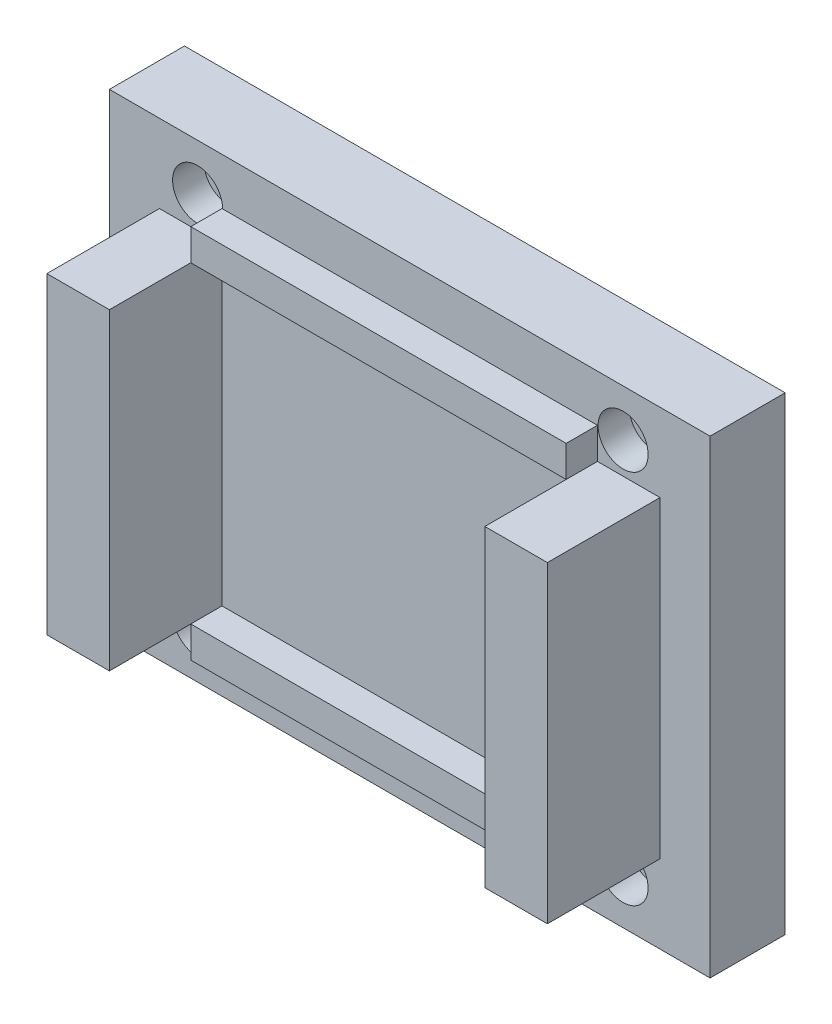
ISO-10303-21;
HEADER;
FILE_DESCRIPTION(('STEP AP214'),'2;1');
FILE_NAME('part.step','',(''),(''),'','','');
FILE_SCHEMA(('AUTOMOTIVE_DESIGN { 1 0 10303 214 1 1 1 1 }'));
ENDSEC;
DATA;
#1=APPLICATION_CONTEXT('core data for automotive mechanical design processes');
#2=APPLICATION_PROTOCOL_DEFINITION('international standard','automotive_design',2000,#1);
#3=PRODUCT_CONTEXT('',#1,'mechanical');
#4=PRODUCT('Part','Part','',(#3));
#5=PRODUCT_RELATED_PRODUCT_CATEGORY('part','',(#4));
#6=PRODUCT_DEFINITION_FORMATION('','',#4);
#7=PRODUCT_DEFINITION_CONTEXT('part definition',#1,'design');
#8=PRODUCT_DEFINITION('design','',#6,#7);
#9=PRODUCT_DEFINITION_SHAPE('','',#8);
#10=(LENGTH_UNIT() NAMED_UNIT(*) SI_UNIT(.MILLI.,.METRE.));
#11=(NAMED_UNIT(*) PLANE_ANGLE_UNIT() SI_UNIT($,.RADIAN.));
#12=(NAMED_UNIT(*) SI_UNIT($,.STERADIAN.) SOLID_ANGLE_UNIT());
#13=UNCERTAINTY_MEASURE_WITH_UNIT(LENGTH_MEASURE(1.E-05),#10,'distance_accuracy_value','');
#14=(GEOMETRIC_REPRESENTATION_CONTEXT(3) GLOBAL_UNCERTAINTY_ASSIGNED_CONTEXT((#13)) GLOBAL_UNIT_ASSIGNED_CONTEXT((#10,
#11,#12)) REPRESENTATION_CONTEXT('',''));
#15=CARTESIAN_POINT('',(0.,0.,0.));
#16=DIRECTION('',(0.,0.,1.));
#17=DIRECTION('',(1.,0.,0.));
#18=AXIS2_PLACEMENT_3D('',#15,#16,#17);
#19=CARTESIAN_POINT('',(18.,12.5,17.));
#20=DIRECTION('',(1.,0.,0.));
#21=DIRECTION('',(0.,0.,-1.));
#22=AXIS2_PLACEMENT_3D('',#19,#20,#21);
#23=PLANE('',#22);
#24=DIRECTION('',(0.,-1.,0.));
#25=VECTOR('',#24,1.);
#26=CARTESIAN_POINT('',(18.,12.5,12.));
#27=LINE('',#26,#25);
#28=CARTESIAN_POINT('',(18.,12.5,12.));
#29=VERTEX_POINT('',#28);
#30=CARTESIAN_POINT('',(18.,7.5,12.));
#31=VERTEX_POINT('',#30);
#32=EDGE_CURVE('E113',#29,#31,#27,.T.);
#33=ORIENTED_EDGE('',*,*,#32,.T.);
#34=DIRECTION('',(0.,0.,-1.));
#35=VECTOR('',#34,1.);
#36=CARTESIAN_POINT('',(18.,7.5,17.));
#37=LINE('',#36,#35);
#38=CARTESIAN_POINT('',(18.,7.5,17.));
#39=VERTEX_POINT('',#38);
#40=EDGE_CURVE('E12',#39,#31,#37,.T.);
#41=ORIENTED_EDGE('',*,*,#40,.F.);
#42=DIRECTION('',(0.,-1.,0.));
#43=VECTOR('',#42,1.);
#44=CARTESIAN_POINT('',(18.,12.5,17.));
#45=LINE('',#44,#43);
#46=CARTESIAN_POINT('',(18.,12.5,17.));
#47=VERTEX_POINT('',#46);
#48=EDGE_CURVE('E101',#47,#39,#45,.T.);
#49=ORIENTED_EDGE('',*,*,#48,.F.);
#50=DIRECTION('',(0.,0.,-1.));
#51=VECTOR('',#50,1.);
#52=CARTESIAN_POINT('',(18.,12.5,17.));
#53=LINE('',#52,#51);
#54=EDGE_CURVE('E109',#47,#29,#53,.T.);
#55=ORIENTED_EDGE('',*,*,#54,.T.);
#56=EDGE_LOOP('',(#33,#41,#49,#55));
#57=FACE_BOUND('',#56,.T.);
#58=ADVANCED_FACE('F50',(#57),#23,.F.);
#59=CARTESIAN_POINT('',(18.,7.5,17.));
#60=DIRECTION('',(0.,1.,0.));
#61=DIRECTION('',(0.,0.,1.));
#62=AXIS2_PLACEMENT_3D('',#59,#60,#61);
#63=PLANE('',#62);
#64=DIRECTION('',(1.,0.,0.));
#65=VECTOR('',#64,1.);
#66=CARTESIAN_POINT('',(18.,7.5,12.));
#67=LINE('',#66,#65);
#68=CARTESIAN_POINT('',(78.,7.5,12.));
#69=VERTEX_POINT('',#68);
#70=EDGE_CURVE('E105',#31,#69,#67,.T.);
#71=ORIENTED_EDGE('',*,*,#70,.T.);
#72=DIRECTION('',(0.,0.,-1.));
#73=VECTOR('',#72,1.);
#74=CARTESIAN_POINT('',(78.,7.5,17.));
#75=LINE('',#74,#73);
#76=CARTESIAN_POINT('',(78.,7.5,17.));
#77=VERTEX_POINT('',#76);
#78=EDGE_CURVE('E58',#77,#69,#75,.T.);
#79=ORIENTED_EDGE('',*,*,#78,.F.);
#80=DIRECTION('',(1.,0.,0.));
#81=VECTOR('',#80,1.);
#82=CARTESIAN_POINT('',(18.,7.5,17.));
#83=LINE('',#82,#81);
#84=EDGE_CURVE('E96',#39,#77,#83,.T.);
#85=ORIENTED_EDGE('',*,*,#84,.F.);
#86=ORIENTED_EDGE('',*,*,#40,.T.);
#87=EDGE_LOOP('',(#71,#79,#85,#86));
#88=FACE_BOUND('',#87,.T.);
#89=ADVANCED_FACE('F104',(#88),#63,.F.);
#90=CARTESIAN_POINT('',(78.,12.5,17.));
#91=DIRECTION('',(-1.,0.,0.));
#92=DIRECTION('',(0.,0.,1.));
#93=AXIS2_PLACEMENT_3D('',#90,#91,#92);
#94=PLANE('',#93);
#95=DIRECTION('',(0.,1.,0.));
#96=VECTOR('',#95,1.);
#97=CARTESIAN_POINT('',(78.,12.5,12.));
#98=LINE('',#97,#96);
#99=CARTESIAN_POINT('',(78.,12.5,12.));
#100=VERTEX_POINT('',#99);
#101=EDGE_CURVE('E83',#69,#100,#98,.T.);
#102=ORIENTED_EDGE('',*,*,#101,.T.);
#103=DIRECTION('',(0.,0.,-1.));
#104=VECTOR('',#103,1.);
#105=CARTESIAN_POINT('',(78.,12.5,17.));
#106=LINE('',#105,#104);
#107=CARTESIAN_POINT('',(78.,12.5,17.));
#108=VERTEX_POINT('',#107);
#109=EDGE_CURVE('E106',#108,#100,#106,.T.);
#110=ORIENTED_EDGE('',*,*,#109,.F.);
#111=DIRECTION('',(0.,1.,0.));
#112=VECTOR('',#111,1.);
#113=CARTESIAN_POINT('',(78.,12.5,17.));
#114=LINE('',#113,#112);
#115=EDGE_CURVE('E99',#77,#108,#114,.T.);
#116=ORIENTED_EDGE('',*,*,#115,.F.);
#117=ORIENTED_EDGE('',*,*,#78,.T.);
#118=EDGE_LOOP('',(#102,#110,#116,#117));
#119=FACE_BOUND('',#118,.T.);
#120=ADVANCED_FACE('F107',(#119),#94,.F.);
#121=CARTESIAN_POINT('',(18.,12.5,17.));
#122=DIRECTION('',(0.,-1.,0.));
#123=DIRECTION('',(1.,0.,0.));
#124=AXIS2_PLACEMENT_3D('',#121,#122,#123);
#125=PLANE('',#124);
#126=DIRECTION('',(-1.,0.,0.));
#127=VECTOR('',#126,1.);
#128=CARTESIAN_POINT('',(18.,12.5,12.));
#129=LINE('',#128,#127);
#130=EDGE_CURVE('E89',#100,#29,#129,.T.);
#131=ORIENTED_EDGE('',*,*,#130,.T.);
#132=ORIENTED_EDGE('',*,*,#54,.F.);
#133=DIRECTION('',(-1.,0.,0.));
#134=VECTOR('',#133,1.);
#135=CARTESIAN_POINT('',(18.,12.5,17.));
#136=LINE('',#135,#134);
#137=EDGE_CURVE('E66',#108,#47,#136,.T.);
#138=ORIENTED_EDGE('',*,*,#137,.F.);
#139=ORIENTED_EDGE('',*,*,#109,.T.);
#140=EDGE_LOOP('',(#131,#132,#138,#139));
#141=FACE_BOUND('',#140,.T.);
#142=ADVANCED_FACE('F120',(#141),#125,.F.);
#143=CARTESIAN_POINT('',(0.,0.,17.));
#144=DIRECTION('',(0.,0.,1.));
#145=DIRECTION('',(1.,0.,0.));
#146=AXIS2_PLACEMENT_3D('',#143,#144,#145);
#147=PLANE('',#146);
#148=ORIENTED_EDGE('',*,*,#48,.T.);
#149=ORIENTED_EDGE('',*,*,#84,.T.);
#150=ORIENTED_EDGE('',*,*,#115,.T.);
#151=ORIENTED_EDGE('',*,*,#137,.T.);
#152=EDGE_LOOP('',(#148,#149,#150,#151));
#153=FACE_BOUND('',#152,.T.);
#154=ADVANCED_FACE('F97',(#153),#147,.T.);
#155=CARTESIAN_POINT('',(0.,0.,12.));
#156=DIRECTION('',(0.,0.,1.));
#157=DIRECTION('',(1.,0.,0.));
#158=AXIS2_PLACEMENT_3D('',#155,#156,#157);
#159=PLANE('',#158);
#160=ORIENTED_EDGE('',*,*,#32,.F.);
#161=ORIENTED_EDGE('',*,*,#130,.F.);
#162=ORIENTED_EDGE('',*,*,#101,.F.);
#163=ORIENTED_EDGE('',*,*,#70,.F.);
#164=EDGE_LOOP('',(#160,#161,#162,#163));
#165=FACE_BOUND('',#164,.T.);
#166=ADVANCED_FACE('F123',(#165),#159,.F.);
#167=CLOSED_SHELL('',(#58,#89,#120,#142,#154,#166));
#168=MANIFOLD_SOLID_BREP('B2',#167);
#169=CARTESIAN_POINT('',(78.,62.5,17.));
#170=DIRECTION('',(-1.,0.,0.));
#171=DIRECTION('',(0.,0.,1.));
#172=AXIS2_PLACEMENT_3D('',#169,#170,#171);
#173=PLANE('',#172);
#174=DIRECTION('',(0.,1.,0.));
#175=VECTOR('',#174,1.);
#176=CARTESIAN_POINT('',(78.,62.5,12.));
#177=LINE('',#176,#175);
#178=CARTESIAN_POINT('',(78.,62.5,12.));
#179=VERTEX_POINT('',#178);
#180=CARTESIAN_POINT('',(78.,67.5,12.));
#181=VERTEX_POINT('',#180);
#182=EDGE_CURVE('E245',#179,#181,#177,.T.);
#183=ORIENTED_EDGE('',*,*,#182,.T.);
#184=DIRECTION('',(0.,0.,-1.));
#185=VECTOR('',#184,1.);
#186=CARTESIAN_POINT('',(78.,67.5,17.));
#187=LINE('',#186,#185);
#188=CARTESIAN_POINT('',(78.,67.5,17.));
#189=VERTEX_POINT('',#188);
#190=EDGE_CURVE('E48',#189,#181,#187,.T.);
#191=ORIENTED_EDGE('',*,*,#190,.F.);
#192=DIRECTION('',(0.,1.,0.));
#193=VECTOR('',#192,1.);
#194=CARTESIAN_POINT('',(78.,62.5,17.));
#195=LINE('',#194,#193);
#196=CARTESIAN_POINT('',(78.,62.5,17.));
#197=VERTEX_POINT('',#196);
#198=EDGE_CURVE('E222',#197,#189,#195,.T.);
#199=ORIENTED_EDGE('',*,*,#198,.F.);
#200=DIRECTION('',(0.,0.,-1.));
#201=VECTOR('',#200,1.);
#202=CARTESIAN_POINT('',(78.,62.5,17.));
#203=LINE('',#202,#201);
#204=EDGE_CURVE('E241',#197,#179,#203,.T.);
#205=ORIENTED_EDGE('',*,*,#204,.T.);
#206=EDGE_LOOP('',(#183,#191,#199,#205));
#207=FACE_BOUND('',#206,.T.);
#208=ADVANCED_FACE('F183',(#207),#173,.F.);
#209=CARTESIAN_POINT('',(18.,67.5,17.));
#210=DIRECTION('',(0.,1.,0.));
#211=DIRECTION('',(0.,0.,1.));
#212=AXIS2_PLACEMENT_3D('',#209,#210,#211);
#213=PLANE('',#212);
#214=DIRECTION('',(1.,0.,0.));
#215=VECTOR('',#214,1.);
#216=CARTESIAN_POINT('',(18.,67.5,12.));
#217=LINE('',#216,#215);
#218=CARTESIAN_POINT('',(18.,67.5,12.));
#219=VERTEX_POINT('',#218);
#220=EDGE_CURVE('E231',#219,#181,#217,.T.);
#221=ORIENTED_EDGE('',*,*,#220,.F.);
#222=DIRECTION('',(0.,0.,-1.));
#223=VECTOR('',#222,1.);
#224=CARTESIAN_POINT('',(18.,67.5,17.));
#225=LINE('',#224,#223);
#226=CARTESIAN_POINT('',(18.,67.5,17.));
#227=VERTEX_POINT('',#226);
#228=EDGE_CURVE('E191',#227,#219,#225,.T.);
#229=ORIENTED_EDGE('',*,*,#228,.F.);
#230=DIRECTION('',(1.,0.,0.));
#231=VECTOR('',#230,1.);
#232=CARTESIAN_POINT('',(18.,67.5,17.));
#233=LINE('',#232,#231);
#234=EDGE_CURVE('E229',#227,#189,#233,.T.);
#235=ORIENTED_EDGE('',*,*,#234,.T.);
#236=ORIENTED_EDGE('',*,*,#190,.T.);
#237=EDGE_LOOP('',(#221,#229,#235,#236));
#238=FACE_BOUND('',#237,.T.);
#239=ADVANCED_FACE('F228',(#238),#213,.T.);
#240=CARTESIAN_POINT('',(18.,62.5,17.));
#241=DIRECTION('',(-1.,0.,0.));
#242=DIRECTION('',(0.,0.,1.));
#243=AXIS2_PLACEMENT_3D('',#240,#241,#242);
#244=PLANE('',#243);
#245=DIRECTION('',(0.,1.,0.));
#246=VECTOR('',#245,1.);
#247=CARTESIAN_POINT('',(18.,62.5,12.));
#248=LINE('',#247,#246);
#249=CARTESIAN_POINT('',(18.,62.5,12.));
#250=VERTEX_POINT('',#249);
#251=EDGE_CURVE('E249',#250,#219,#248,.T.);
#252=ORIENTED_EDGE('',*,*,#251,.F.);
#253=DIRECTION('',(0.,0.,-1.));
#254=VECTOR('',#253,1.);
#255=CARTESIAN_POINT('',(18.,62.5,17.));
#256=LINE('',#255,#254);
#257=CARTESIAN_POINT('',(18.,62.5,17.));
#258=VERTEX_POINT('',#257);
#259=EDGE_CURVE('E214',#258,#250,#256,.T.);
#260=ORIENTED_EDGE('',*,*,#259,.F.);
#261=DIRECTION('',(0.,1.,0.));
#262=VECTOR('',#261,1.);
#263=CARTESIAN_POINT('',(18.,62.5,17.));
#264=LINE('',#263,#262);
#265=EDGE_CURVE('E237',#258,#227,#264,.T.);
#266=ORIENTED_EDGE('',*,*,#265,.T.);
#267=ORIENTED_EDGE('',*,*,#228,.T.);
#268=EDGE_LOOP('',(#252,#260,#266,#267));
#269=FACE_BOUND('',#268,.T.);
#270=ADVANCED_FACE('F239',(#269),#244,.T.);
#271=CARTESIAN_POINT('',(18.,62.5,17.));
#272=DIRECTION('',(0.,1.,0.));
#273=DIRECTION('',(0.,0.,1.));
#274=AXIS2_PLACEMENT_3D('',#271,#272,#273);
#275=PLANE('',#274);
#276=DIRECTION('',(1.,0.,0.));
#277=VECTOR('',#276,1.);
#278=CARTESIAN_POINT('',(18.,62.5,12.));
#279=LINE('',#278,#277);
#280=EDGE_CURVE('E217',#250,#179,#279,.T.);
#281=ORIENTED_EDGE('',*,*,#280,.T.);
#282=ORIENTED_EDGE('',*,*,#204,.F.);
#283=DIRECTION('',(1.,0.,0.));
#284=VECTOR('',#283,1.);
#285=CARTESIAN_POINT('',(18.,62.5,17.));
#286=LINE('',#285,#284);
#287=EDGE_CURVE('E199',#258,#197,#286,.T.);
#288=ORIENTED_EDGE('',*,*,#287,.F.);
#289=ORIENTED_EDGE('',*,*,#259,.T.);
#290=EDGE_LOOP('',(#281,#282,#288,#289));
#291=FACE_BOUND('',#290,.T.);
#292=ADVANCED_FACE('F262',(#291),#275,.F.);
#293=CARTESIAN_POINT('',(0.,0.,17.));
#294=DIRECTION('',(0.,0.,-1.));
#295=DIRECTION('',(-1.,0.,0.));
#296=AXIS2_PLACEMENT_3D('',#293,#294,#295);
#297=PLANE('',#296);
#298=ORIENTED_EDGE('',*,*,#198,.T.);
#299=ORIENTED_EDGE('',*,*,#234,.F.);
#300=ORIENTED_EDGE('',*,*,#265,.F.);
#301=ORIENTED_EDGE('',*,*,#287,.T.);
#302=EDGE_LOOP('',(#298,#299,#300,#301));
#303=FACE_BOUND('',#302,.T.);
#304=ADVANCED_FACE('F236',(#303),#297,.F.);
#305=CARTESIAN_POINT('',(0.,0.,12.));
#306=DIRECTION('',(0.,0.,-1.));
#307=DIRECTION('',(-1.,0.,0.));
#308=AXIS2_PLACEMENT_3D('',#305,#306,#307);
#309=PLANE('',#308);
#310=ORIENTED_EDGE('',*,*,#182,.F.);
#311=ORIENTED_EDGE('',*,*,#280,.F.);
#312=ORIENTED_EDGE('',*,*,#251,.T.);
#313=ORIENTED_EDGE('',*,*,#220,.T.);
#314=EDGE_LOOP('',(#310,#311,#312,#313));
#315=FACE_BOUND('',#314,.T.);
#316=ADVANCED_FACE('F256',(#315),#309,.T.);
#317=CLOSED_SHELL('',(#208,#239,#270,#292,#304,#316));
#318=MANIFOLD_SOLID_BREP('B6',#317);
#319=CARTESIAN_POINT('',(0.,0.,12.));
#320=DIRECTION('',(0.,0.,-1.));
#321=DIRECTION('',(-1.,0.,0.));
#322=AXIS2_PLACEMENT_3D('',#319,#320,#321);
#323=PLANE('',#322);
#324=DIRECTION('',(1.,0.,0.));
#325=VECTOR('',#324,1.);
#326=CARTESIAN_POINT('',(0.,62.5,12.));
#327=LINE('',#326,#325);
#328=CARTESIAN_POINT('',(78.,62.5,12.));
#329=VERTEX_POINT('',#328);
#330=CARTESIAN_POINT('',(88.,62.5,12.));
#331=VERTEX_POINT('',#330);
#332=EDGE_CURVE('E324',#329,#331,#327,.T.);
#333=ORIENTED_EDGE('',*,*,#332,.T.);
#334=DIRECTION('',(0.,-1.,0.));
#335=VECTOR('',#334,1.);
#336=CARTESIAN_POINT('',(88.,0.,12.));
#337=LINE('',#336,#335);
#338=CARTESIAN_POINT('',(88.,12.5,12.));
#339=VERTEX_POINT('',#338);
#340=EDGE_CURVE('E402',#331,#339,#337,.T.);
#341=ORIENTED_EDGE('',*,*,#340,.T.);
#342=DIRECTION('',(1.,0.,0.));
#343=VECTOR('',#342,1.);
#344=CARTESIAN_POINT('',(0.,12.5,12.));
#345=LINE('',#344,#343);
#346=CARTESIAN_POINT('',(78.,12.5,12.));
#347=VERTEX_POINT('',#346);
#348=EDGE_CURVE('E417',#347,#339,#345,.T.);
#349=ORIENTED_EDGE('',*,*,#348,.F.);
#350=DIRECTION('',(0.,1.,0.));
#351=VECTOR('',#350,1.);
#352=CARTESIAN_POINT('',(78.,0.,12.));
#353=LINE('',#352,#351);
#354=EDGE_CURVE('E329',#347,#329,#353,.T.);
#355=ORIENTED_EDGE('',*,*,#354,.T.);
#356=EDGE_LOOP('',(#333,#341,#349,#355));
#357=FACE_BOUND('',#356,.T.);
#358=DIRECTION('',(0.,-1.,0.));
#359=VECTOR('',#358,1.);
#360=CARTESIAN_POINT('',(0.,0.,12.));
#361=LINE('',#360,#359);
#362=CARTESIAN_POINT('',(0.,75.,12.));
#363=VERTEX_POINT('',#362);
#364=CARTESIAN_POINT('',(0.,0.,12.));
#365=VERTEX_POINT('',#364);
#366=EDGE_CURVE('E506',#363,#365,#361,.T.);
#367=ORIENTED_EDGE('',*,*,#366,.T.);
#368=DIRECTION('',(1.,0.,0.));
#369=VECTOR('',#368,1.);
#370=CARTESIAN_POINT('',(0.,0.,12.));
#371=LINE('',#370,#369);
#372=CARTESIAN_POINT('',(96.,0.,12.));
#373=VERTEX_POINT('',#372);
#374=EDGE_CURVE('E509',#365,#373,#371,.T.);
#375=ORIENTED_EDGE('',*,*,#374,.T.);
#376=DIRECTION('',(0.,1.,0.));
#377=VECTOR('',#376,1.);
#378=CARTESIAN_POINT('',(96.,0.,12.));
#379=LINE('',#378,#377);
#380=CARTESIAN_POINT('',(96.,75.,12.));
#381=VERTEX_POINT('',#380);
#382=EDGE_CURVE('E512',#373,#381,#379,.T.);
#383=ORIENTED_EDGE('',*,*,#382,.T.);
#384=DIRECTION('',(-1.,0.,0.));
#385=VECTOR('',#384,1.);
#386=CARTESIAN_POINT('',(0.,75.,12.));
#387=LINE('',#386,#385);
#388=EDGE_CURVE('E514',#381,#363,#387,.T.);
#389=ORIENTED_EDGE('',*,*,#388,.T.);
#390=EDGE_LOOP('',(#367,#375,#383,#389));
#391=FACE_BOUND('',#390,.T.);
#392=CARTESIAN_POINT('',(14.0956243396109,67.5,12.));
#393=DIRECTION('',(0.,0.,1.));
#394=DIRECTION('',(1.,0.,0.));
#395=AXIS2_PLACEMENT_3D('',#392,#393,#394);
#396=CIRCLE('',#395,4.);
#397=CARTESIAN_POINT('',(18.0956243396109,67.5,12.));
#398=VERTEX_POINT('',#397);
#399=EDGE_CURVE('E484',#398,#398,#396,.T.);
#400=ORIENTED_EDGE('',*,*,#399,.F.);
#401=EDGE_LOOP('',(#400));
#402=FACE_BOUND('',#401,.T.);
#403=CARTESIAN_POINT('',(82.0956243396109,67.5,12.));
#404=DIRECTION('',(0.,0.,1.));
#405=DIRECTION('',(1.,0.,0.));
#406=AXIS2_PLACEMENT_3D('',#403,#404,#405);
#407=CIRCLE('',#406,4.00000000000001);
#408=CARTESIAN_POINT('',(86.0956243396109,67.5,12.));
#409=VERTEX_POINT('',#408);
#410=EDGE_CURVE('E485',#409,#409,#407,.T.);
#411=ORIENTED_EDGE('',*,*,#410,.F.);
#412=EDGE_LOOP('',(#411));
#413=FACE_BOUND('',#412,.T.);
#414=CARTESIAN_POINT('',(82.0956243396109,7.5,12.));
#415=DIRECTION('',(0.,0.,1.));
#416=DIRECTION('',(1.,0.,0.));
#417=AXIS2_PLACEMENT_3D('',#414,#415,#416);
#418=CIRCLE('',#417,4.00000000000001);
#419=CARTESIAN_POINT('',(86.0956243396109,7.5,12.));
#420=VERTEX_POINT('',#419);
#421=EDGE_CURVE('E491',#420,#420,#418,.T.);
#422=ORIENTED_EDGE('',*,*,#421,.F.);
#423=EDGE_LOOP('',(#422));
#424=FACE_BOUND('',#423,.T.);
#425=CARTESIAN_POINT('',(14.0956243396109,7.5,12.));
#426=DIRECTION('',(0.,0.,1.));
#427=DIRECTION('',(1.,0.,0.));
#428=AXIS2_PLACEMENT_3D('',#425,#426,#427);
#429=CIRCLE('',#428,4.);
#430=CARTESIAN_POINT('',(18.0956243396109,7.5,12.));
#431=VERTEX_POINT('',#430);
#432=EDGE_CURVE('E497',#431,#431,#429,.T.);
#433=ORIENTED_EDGE('',*,*,#432,.F.);
#434=EDGE_LOOP('',(#433));
#435=FACE_BOUND('',#434,.T.);
#436=DIRECTION('',(-1.,0.,0.));
#437=VECTOR('',#436,1.);
#438=CARTESIAN_POINT('',(0.,62.5,12.));
#439=LINE('',#438,#437);
#440=CARTESIAN_POINT('',(18.,62.5,12.));
#441=VERTEX_POINT('',#440);
#442=CARTESIAN_POINT('',(8.,62.5,12.));
#443=VERTEX_POINT('',#442);
#444=EDGE_CURVE('E405',#441,#443,#439,.T.);
#445=ORIENTED_EDGE('',*,*,#444,.F.);
#446=DIRECTION('',(0.,1.,0.));
#447=VECTOR('',#446,1.);
#448=CARTESIAN_POINT('',(18.,0.,12.));
#449=LINE('',#448,#447);
#450=CARTESIAN_POINT('',(18.,12.5,12.));
#451=VERTEX_POINT('',#450);
#452=EDGE_CURVE('E440',#451,#441,#449,.T.);
#453=ORIENTED_EDGE('',*,*,#452,.F.);
#454=DIRECTION('',(-1.,0.,0.));
#455=VECTOR('',#454,1.);
#456=CARTESIAN_POINT('',(0.,12.5,12.));
#457=LINE('',#456,#455);
#458=CARTESIAN_POINT('',(8.00000000000001,12.5,12.));
#459=VERTEX_POINT('',#458);
#460=EDGE_CURVE('E453',#451,#459,#457,.T.);
#461=ORIENTED_EDGE('',*,*,#460,.T.);
#462=DIRECTION('',(0.,-1.,0.));
#463=VECTOR('',#462,1.);
#464=CARTESIAN_POINT('',(8.00000000000001,0.,12.));
#465=LINE('',#464,#463);
#466=EDGE_CURVE('E450',#443,#459,#465,.T.);
#467=ORIENTED_EDGE('',*,*,#466,.F.);
#468=EDGE_LOOP('',(#445,#453,#461,#467));
#469=FACE_BOUND('',#468,.T.);
#470=ADVANCED_FACE('F307',(#357,#391,#402,#413,#424,#435,#469),#323,.F.);
#471=CARTESIAN_POINT('',(0.,0.,12.));
#472=DIRECTION('',(1.,0.,0.));
#473=DIRECTION('',(0.,0.,-1.));
#474=AXIS2_PLACEMENT_3D('',#471,#472,#473);
#475=PLANE('',#474);
#476=DIRECTION('',(0.,-1.,0.));
#477=VECTOR('',#476,1.);
#478=CARTESIAN_POINT('',(0.,0.,0.));
#479=LINE('',#478,#477);
#480=CARTESIAN_POINT('',(0.,75.,0.));
#481=VERTEX_POINT('',#480);
#482=CARTESIAN_POINT('',(0.,0.,0.));
#483=VERTEX_POINT('',#482);
#484=EDGE_CURVE('E503',#481,#483,#479,.T.);
#485=ORIENTED_EDGE('',*,*,#484,.T.);
#486=DIRECTION('',(0.,0.,-1.));
#487=VECTOR('',#486,1.);
#488=CARTESIAN_POINT('',(0.,0.,12.));
#489=LINE('',#488,#487);
#490=EDGE_CURVE('E181',#365,#483,#489,.T.);
#491=ORIENTED_EDGE('',*,*,#490,.F.);
#492=ORIENTED_EDGE('',*,*,#366,.F.);
#493=DIRECTION('',(0.,0.,-1.));
#494=VECTOR('',#493,1.);
#495=CARTESIAN_POINT('',(0.,75.,12.));
#496=LINE('',#495,#494);
#497=EDGE_CURVE('E516',#363,#481,#496,.T.);
#498=ORIENTED_EDGE('',*,*,#497,.T.);
#499=EDGE_LOOP('',(#485,#491,#492,#498));
#500=FACE_BOUND('',#499,.T.);
#501=ADVANCED_FACE('F309',(#500),#475,.F.);
#502=CARTESIAN_POINT('',(0.,0.,12.));
#503=DIRECTION('',(0.,1.,0.));
#504=DIRECTION('',(0.,0.,1.));
#505=AXIS2_PLACEMENT_3D('',#502,#503,#504);
#506=PLANE('',#505);
#507=DIRECTION('',(1.,0.,0.));
#508=VECTOR('',#507,1.);
#509=CARTESIAN_POINT('',(0.,0.,0.));
#510=LINE('',#509,#508);
#511=CARTESIAN_POINT('',(96.,0.,0.));
#512=VERTEX_POINT('',#511);
#513=EDGE_CURVE('E519',#483,#512,#510,.T.);
#514=ORIENTED_EDGE('',*,*,#513,.T.);
#515=DIRECTION('',(0.,0.,-1.));
#516=VECTOR('',#515,1.);
#517=CARTESIAN_POINT('',(96.,0.,12.));
#518=LINE('',#517,#516);
#519=EDGE_CURVE('E316',#373,#512,#518,.T.);
#520=ORIENTED_EDGE('',*,*,#519,.F.);
#521=ORIENTED_EDGE('',*,*,#374,.F.);
#522=ORIENTED_EDGE('',*,*,#490,.T.);
#523=EDGE_LOOP('',(#514,#520,#521,#522));
#524=FACE_BOUND('',#523,.T.);
#525=ADVANCED_FACE('F640',(#524),#506,.F.);
#526=CARTESIAN_POINT('',(96.,0.,12.));
#527=DIRECTION('',(-1.,0.,0.));
#528=DIRECTION('',(0.,0.,1.));
#529=AXIS2_PLACEMENT_3D('',#526,#527,#528);
#530=PLANE('',#529);
#531=DIRECTION('',(0.,1.,0.));
#532=VECTOR('',#531,1.);
#533=CARTESIAN_POINT('',(96.,0.,0.));
#534=LINE('',#533,#532);
#535=CARTESIAN_POINT('',(96.,75.,0.));
#536=VERTEX_POINT('',#535);
#537=EDGE_CURVE('E521',#512,#536,#534,.T.);
#538=ORIENTED_EDGE('',*,*,#537,.T.);
#539=DIRECTION('',(0.,0.,-1.));
#540=VECTOR('',#539,1.);
#541=CARTESIAN_POINT('',(96.,75.,12.));
#542=LINE('',#541,#540);
#543=EDGE_CURVE('E526',#381,#536,#542,.T.);
#544=ORIENTED_EDGE('',*,*,#543,.F.);
#545=ORIENTED_EDGE('',*,*,#382,.F.);
#546=ORIENTED_EDGE('',*,*,#519,.T.);
#547=EDGE_LOOP('',(#538,#544,#545,#546));
#548=FACE_BOUND('',#547,.T.);
#549=ADVANCED_FACE('F637',(#548),#530,.F.);
#550=CARTESIAN_POINT('',(0.,75.,12.));
#551=DIRECTION('',(0.,-1.,0.));
#552=DIRECTION('',(0.,0.,-1.));
#553=AXIS2_PLACEMENT_3D('',#550,#551,#552);
#554=PLANE('',#553);
#555=DIRECTION('',(-1.,0.,0.));
#556=VECTOR('',#555,1.);
#557=CARTESIAN_POINT('',(0.,75.,0.));
#558=LINE('',#557,#556);
#559=EDGE_CURVE('E510',#536,#481,#558,.T.);
#560=ORIENTED_EDGE('',*,*,#559,.T.);
#561=ORIENTED_EDGE('',*,*,#497,.F.);
#562=ORIENTED_EDGE('',*,*,#388,.F.);
#563=ORIENTED_EDGE('',*,*,#543,.T.);
#564=EDGE_LOOP('',(#560,#561,#562,#563));
#565=FACE_BOUND('',#564,.T.);
#566=ADVANCED_FACE('F633',(#565),#554,.F.);
#567=CARTESIAN_POINT('',(0.,0.,0.));
#568=DIRECTION('',(0.,0.,-1.));
#569=DIRECTION('',(-1.,0.,0.));
#570=AXIS2_PLACEMENT_3D('',#567,#568,#569);
#571=PLANE('',#570);
#572=CARTESIAN_POINT('',(14.0956243396109,7.5,0.));
#573=DIRECTION('',(0.,0.,1.));
#574=DIRECTION('',(1.,0.,0.));
#575=AXIS2_PLACEMENT_3D('',#572,#573,#574);
#576=CIRCLE('',#575,2.5);
#577=CARTESIAN_POINT('',(16.5956243396109,7.5,0.));
#578=VERTEX_POINT('',#577);
#579=EDGE_CURVE('E468',#578,#578,#576,.T.);
#580=ORIENTED_EDGE('',*,*,#579,.T.);
#581=EDGE_LOOP('',(#580));
#582=FACE_BOUND('',#581,.T.);
#583=CARTESIAN_POINT('',(82.0956243396109,7.5,0.));
#584=DIRECTION('',(0.,0.,1.));
#585=DIRECTION('',(1.,0.,0.));
#586=AXIS2_PLACEMENT_3D('',#583,#584,#585);
#587=CIRCLE('',#586,2.50000000000001);
#588=CARTESIAN_POINT('',(84.5956243396109,7.5,0.));
#589=VERTEX_POINT('',#588);
#590=EDGE_CURVE('E473',#589,#589,#587,.T.);
#591=ORIENTED_EDGE('',*,*,#590,.T.);
#592=EDGE_LOOP('',(#591));
#593=FACE_BOUND('',#592,.T.);
#594=CARTESIAN_POINT('',(82.0956243396109,67.5,0.));
#595=DIRECTION('',(0.,0.,1.));
#596=DIRECTION('',(1.,0.,0.));
#597=AXIS2_PLACEMENT_3D('',#594,#595,#596);
#598=CIRCLE('',#597,2.50000000000001);
#599=CARTESIAN_POINT('',(84.5956243396109,67.5,0.));
#600=VERTEX_POINT('',#599);
#601=EDGE_CURVE('E469',#600,#600,#598,.T.);
#602=ORIENTED_EDGE('',*,*,#601,.T.);
#603=EDGE_LOOP('',(#602));
#604=FACE_BOUND('',#603,.T.);
#605=CARTESIAN_POINT('',(14.0956243396109,67.5,0.));
#606=DIRECTION('',(0.,0.,1.));
#607=DIRECTION('',(1.,0.,0.));
#608=AXIS2_PLACEMENT_3D('',#605,#606,#607);
#609=CIRCLE('',#608,2.5);
#610=CARTESIAN_POINT('',(16.5956243396109,67.5,0.));
#611=VERTEX_POINT('',#610);
#612=EDGE_CURVE('E472',#611,#611,#609,.T.);
#613=ORIENTED_EDGE('',*,*,#612,.T.);
#614=EDGE_LOOP('',(#613));
#615=FACE_BOUND('',#614,.T.);
#616=ORIENTED_EDGE('',*,*,#484,.F.);
#617=ORIENTED_EDGE('',*,*,#559,.F.);
#618=ORIENTED_EDGE('',*,*,#537,.F.);
#619=ORIENTED_EDGE('',*,*,#513,.F.);
#620=EDGE_LOOP('',(#616,#617,#618,#619));
#621=FACE_BOUND('',#620,.T.);
#622=ADVANCED_FACE('F555',(#582,#593,#604,#615,#621),#571,.T.);
#623=CARTESIAN_POINT('',(14.0956243396109,67.5,7.));
#624=DIRECTION('',(0.,0.,1.));
#625=DIRECTION('',(1.,0.,0.));
#626=AXIS2_PLACEMENT_3D('',#623,#624,#625);
#627=CYLINDRICAL_SURFACE('',#626,4.);
#628=CARTESIAN_POINT('',(14.0956243396109,67.5,7.));
#629=DIRECTION('',(0.,0.,1.));
#630=DIRECTION('',(1.,0.,0.));
#631=AXIS2_PLACEMENT_3D('',#628,#629,#630);
#632=CIRCLE('',#631,4.);
#633=CARTESIAN_POINT('',(18.0956243396109,67.5,7.));
#634=VERTEX_POINT('',#633);
#635=EDGE_CURVE('E500',#634,#634,#632,.T.);
#636=ORIENTED_EDGE('',*,*,#635,.F.);
#637=EDGE_LOOP('',(#636));
#638=FACE_BOUND('',#637,.T.);
#639=ORIENTED_EDGE('',*,*,#399,.T.);
#640=EDGE_LOOP('',(#639));
#641=FACE_BOUND('',#640,.T.);
#642=ADVANCED_FACE('F549',(#638,#641),#627,.F.);
#643=CARTESIAN_POINT('',(14.0956243396109,67.5,7.));
#644=DIRECTION('',(0.,0.,1.));
#645=DIRECTION('',(1.,0.,0.));
#646=AXIS2_PLACEMENT_3D('',#643,#644,#645);
#647=PLANE('',#646);
#648=CARTESIAN_POINT('',(14.0956243396109,67.5,7.));
#649=DIRECTION('',(0.,0.,1.));
#650=DIRECTION('',(1.,0.,0.));
#651=AXIS2_PLACEMENT_3D('',#648,#649,#650);
#652=CIRCLE('',#651,2.5);
#653=CARTESIAN_POINT('',(16.5956243396109,67.5,7.));
#654=VERTEX_POINT('',#653);
#655=EDGE_CURVE('E311',#654,#654,#652,.T.);
#656=ORIENTED_EDGE('',*,*,#655,.F.);
#657=EDGE_LOOP('',(#656));
#658=FACE_BOUND('',#657,.T.);
#659=ORIENTED_EDGE('',*,*,#635,.T.);
#660=EDGE_LOOP('',(#659));
#661=FACE_BOUND('',#660,.T.);
#662=ADVANCED_FACE('F545',(#658,#661),#647,.T.);
#663=CARTESIAN_POINT('',(82.0956243396109,67.5,7.));
#664=DIRECTION('',(0.,0.,1.));
#665=DIRECTION('',(1.,0.,0.));
#666=AXIS2_PLACEMENT_3D('',#663,#664,#665);
#667=CYLINDRICAL_SURFACE('',#666,4.00000000000001);
#668=CARTESIAN_POINT('',(82.0956243396109,67.5,7.));
#669=DIRECTION('',(0.,0.,1.));
#670=DIRECTION('',(1.,0.,0.));
#671=AXIS2_PLACEMENT_3D('',#668,#669,#670);
#672=CIRCLE('',#671,4.00000000000001);
#673=CARTESIAN_POINT('',(86.0956243396109,67.5,7.));
#674=VERTEX_POINT('',#673);
#675=EDGE_CURVE('E481',#674,#674,#672,.T.);
#676=ORIENTED_EDGE('',*,*,#675,.F.);
#677=EDGE_LOOP('',(#676));
#678=FACE_BOUND('',#677,.T.);
#679=ORIENTED_EDGE('',*,*,#410,.T.);
#680=EDGE_LOOP('',(#679));
#681=FACE_BOUND('',#680,.T.);
#682=ADVANCED_FACE('F548',(#678,#681),#667,.F.);
#683=CARTESIAN_POINT('',(82.0956243396109,67.5,7.));
#684=DIRECTION('',(0.,0.,1.));
#685=DIRECTION('',(1.,0.,0.));
#686=AXIS2_PLACEMENT_3D('',#683,#684,#685);
#687=PLANE('',#686);
#688=CARTESIAN_POINT('',(82.0956243396109,67.5,7.));
#689=DIRECTION('',(0.,0.,1.));
#690=DIRECTION('',(1.,0.,0.));
#691=AXIS2_PLACEMENT_3D('',#688,#689,#690);
#692=CIRCLE('',#691,2.50000000000001);
#693=CARTESIAN_POINT('',(84.5956243396109,67.5,7.));
#694=VERTEX_POINT('',#693);
#695=EDGE_CURVE('E535',#694,#694,#692,.T.);
#696=ORIENTED_EDGE('',*,*,#695,.F.);
#697=EDGE_LOOP('',(#696));
#698=FACE_BOUND('',#697,.T.);
#699=ORIENTED_EDGE('',*,*,#675,.T.);
#700=EDGE_LOOP('',(#699));
#701=FACE_BOUND('',#700,.T.);
#702=ADVANCED_FACE('F609',(#698,#701),#687,.T.);
#703=CARTESIAN_POINT('',(82.0956243396109,7.5,7.));
#704=DIRECTION('',(0.,0.,1.));
#705=DIRECTION('',(1.,0.,0.));
#706=AXIS2_PLACEMENT_3D('',#703,#704,#705);
#707=CYLINDRICAL_SURFACE('',#706,4.00000000000001);
#708=CARTESIAN_POINT('',(82.0956243396109,7.5,7.));
#709=DIRECTION('',(0.,0.,1.));
#710=DIRECTION('',(1.,0.,0.));
#711=AXIS2_PLACEMENT_3D('',#708,#709,#710);
#712=CIRCLE('',#711,4.00000000000001);
#713=CARTESIAN_POINT('',(86.0956243396109,7.5,7.));
#714=VERTEX_POINT('',#713);
#715=EDGE_CURVE('E488',#714,#714,#712,.T.);
#716=ORIENTED_EDGE('',*,*,#715,.F.);
#717=EDGE_LOOP('',(#716));
#718=FACE_BOUND('',#717,.T.);
#719=ORIENTED_EDGE('',*,*,#421,.T.);
#720=EDGE_LOOP('',(#719));
#721=FACE_BOUND('',#720,.T.);
#722=ADVANCED_FACE('F612',(#718,#721),#707,.F.);
#723=CARTESIAN_POINT('',(82.0956243396109,7.5,7.));
#724=DIRECTION('',(0.,0.,1.));
#725=DIRECTION('',(1.,0.,0.));
#726=AXIS2_PLACEMENT_3D('',#723,#724,#725);
#727=PLANE('',#726);
#728=CARTESIAN_POINT('',(82.0956243396109,7.5,7.));
#729=DIRECTION('',(0.,0.,1.));
#730=DIRECTION('',(1.,0.,0.));
#731=AXIS2_PLACEMENT_3D('',#728,#729,#730);
#732=CIRCLE('',#731,2.50000000000001);
#733=CARTESIAN_POINT('',(84.5956243396109,7.5,7.));
#734=VERTEX_POINT('',#733);
#735=EDGE_CURVE('E533',#734,#734,#732,.T.);
#736=ORIENTED_EDGE('',*,*,#735,.F.);
#737=EDGE_LOOP('',(#736));
#738=FACE_BOUND('',#737,.T.);
#739=ORIENTED_EDGE('',*,*,#715,.T.);
#740=EDGE_LOOP('',(#739));
#741=FACE_BOUND('',#740,.T.);
#742=ADVANCED_FACE('F617',(#738,#741),#727,.T.);
#743=CARTESIAN_POINT('',(14.0956243396109,7.5,7.));
#744=DIRECTION('',(0.,0.,1.));
#745=DIRECTION('',(1.,0.,0.));
#746=AXIS2_PLACEMENT_3D('',#743,#744,#745);
#747=CYLINDRICAL_SURFACE('',#746,4.);
#748=CARTESIAN_POINT('',(14.0956243396109,7.5,7.));
#749=DIRECTION('',(0.,0.,1.));
#750=DIRECTION('',(1.,0.,0.));
#751=AXIS2_PLACEMENT_3D('',#748,#749,#750);
#752=CIRCLE('',#751,4.);
#753=CARTESIAN_POINT('',(18.0956243396109,7.5,7.));
#754=VERTEX_POINT('',#753);
#755=EDGE_CURVE('E494',#754,#754,#752,.T.);
#756=ORIENTED_EDGE('',*,*,#755,.F.);
#757=EDGE_LOOP('',(#756));
#758=FACE_BOUND('',#757,.T.);
#759=ORIENTED_EDGE('',*,*,#432,.T.);
#760=EDGE_LOOP('',(#759));
#761=FACE_BOUND('',#760,.T.);
#762=ADVANCED_FACE('F620',(#758,#761),#747,.F.);
#763=CARTESIAN_POINT('',(14.0956243396109,7.5,7.));
#764=DIRECTION('',(0.,0.,1.));
#765=DIRECTION('',(1.,0.,0.));
#766=AXIS2_PLACEMENT_3D('',#763,#764,#765);
#767=PLANE('',#766);
#768=CARTESIAN_POINT('',(14.0956243396109,7.5,7.));
#769=DIRECTION('',(0.,0.,1.));
#770=DIRECTION('',(1.,0.,0.));
#771=AXIS2_PLACEMENT_3D('',#768,#769,#770);
#772=CIRCLE('',#771,2.5);
#773=CARTESIAN_POINT('',(16.5956243396109,7.5,7.));
#774=VERTEX_POINT('',#773);
#775=EDGE_CURVE('E480',#774,#774,#772,.T.);
#776=ORIENTED_EDGE('',*,*,#775,.F.);
#777=EDGE_LOOP('',(#776));
#778=FACE_BOUND('',#777,.T.);
#779=ORIENTED_EDGE('',*,*,#755,.T.);
#780=EDGE_LOOP('',(#779));
#781=FACE_BOUND('',#780,.T.);
#782=ADVANCED_FACE('F605',(#778,#781),#767,.T.);
#783=CARTESIAN_POINT('',(14.0956243396109,7.5,0.));
#784=DIRECTION('',(0.,0.,1.));
#785=DIRECTION('',(1.,0.,0.));
#786=AXIS2_PLACEMENT_3D('',#783,#784,#785);
#787=CYLINDRICAL_SURFACE('',#786,2.5);
#788=ORIENTED_EDGE('',*,*,#775,.T.);
#789=EDGE_LOOP('',(#788));
#790=FACE_BOUND('',#789,.T.);
#791=ORIENTED_EDGE('',*,*,#579,.F.);
#792=EDGE_LOOP('',(#791));
#793=FACE_BOUND('',#792,.T.);
#794=ADVANCED_FACE('F601',(#790,#793),#787,.F.);
#795=CARTESIAN_POINT('',(82.0956243396109,7.5,0.));
#796=DIRECTION('',(0.,0.,1.));
#797=DIRECTION('',(1.,0.,0.));
#798=AXIS2_PLACEMENT_3D('',#795,#796,#797);
#799=CYLINDRICAL_SURFACE('',#798,2.50000000000001);
#800=ORIENTED_EDGE('',*,*,#735,.T.);
#801=EDGE_LOOP('',(#800));
#802=FACE_BOUND('',#801,.T.);
#803=ORIENTED_EDGE('',*,*,#590,.F.);
#804=EDGE_LOOP('',(#803));
#805=FACE_BOUND('',#804,.T.);
#806=ADVANCED_FACE('F598',(#802,#805),#799,.F.);
#807=CARTESIAN_POINT('',(82.0956243396109,67.5,0.));
#808=DIRECTION('',(0.,0.,1.));
#809=DIRECTION('',(1.,0.,0.));
#810=AXIS2_PLACEMENT_3D('',#807,#808,#809);
#811=CYLINDRICAL_SURFACE('',#810,2.50000000000001);
#812=ORIENTED_EDGE('',*,*,#695,.T.);
#813=EDGE_LOOP('',(#812));
#814=FACE_BOUND('',#813,.T.);
#815=ORIENTED_EDGE('',*,*,#601,.F.);
#816=EDGE_LOOP('',(#815));
#817=FACE_BOUND('',#816,.T.);
#818=ADVANCED_FACE('F595',(#814,#817),#811,.F.);
#819=CARTESIAN_POINT('',(14.0956243396109,67.5,0.));
#820=DIRECTION('',(0.,0.,1.));
#821=DIRECTION('',(1.,0.,0.));
#822=AXIS2_PLACEMENT_3D('',#819,#820,#821);
#823=CYLINDRICAL_SURFACE('',#822,2.5);
#824=ORIENTED_EDGE('',*,*,#655,.T.);
#825=EDGE_LOOP('',(#824));
#826=FACE_BOUND('',#825,.T.);
#827=ORIENTED_EDGE('',*,*,#612,.F.);
#828=EDGE_LOOP('',(#827));
#829=FACE_BOUND('',#828,.T.);
#830=ADVANCED_FACE('F542',(#826,#829),#823,.F.);
#831=CARTESIAN_POINT('',(0.,62.5,30.));
#832=DIRECTION('',(0.,-1.,0.));
#833=DIRECTION('',(0.,0.,-1.));
#834=AXIS2_PLACEMENT_3D('',#831,#832,#833);
#835=PLANE('',#834);
#836=ORIENTED_EDGE('',*,*,#444,.T.);
#837=DIRECTION('',(0.,0.,-1.));
#838=VECTOR('',#837,1.);
#839=CARTESIAN_POINT('',(8.,62.5,30.));
#840=LINE('',#839,#838);
#841=CARTESIAN_POINT('',(8.,62.5,30.));
#842=VERTEX_POINT('',#841);
#843=EDGE_CURVE('E465',#842,#443,#840,.T.);
#844=ORIENTED_EDGE('',*,*,#843,.F.);
#845=DIRECTION('',(-1.,0.,0.));
#846=VECTOR('',#845,1.);
#847=CARTESIAN_POINT('',(0.,62.5,30.));
#848=LINE('',#847,#846);
#849=CARTESIAN_POINT('',(18.,62.5,30.));
#850=VERTEX_POINT('',#849);
#851=EDGE_CURVE('E436',#850,#842,#848,.T.);
#852=ORIENTED_EDGE('',*,*,#851,.F.);
#853=DIRECTION('',(0.,0.,-1.));
#854=VECTOR('',#853,1.);
#855=CARTESIAN_POINT('',(18.,62.5,30.));
#856=LINE('',#855,#854);
#857=EDGE_CURVE('E447',#850,#441,#856,.T.);
#858=ORIENTED_EDGE('',*,*,#857,.T.);
#859=EDGE_LOOP('',(#836,#844,#852,#858));
#860=FACE_BOUND('',#859,.T.);
#861=ADVANCED_FACE('F576',(#860),#835,.F.);
#862=CARTESIAN_POINT('',(8.00000000000001,0.,30.));
#863=DIRECTION('',(1.,0.,0.));
#864=DIRECTION('',(0.,1.,0.));
#865=AXIS2_PLACEMENT_3D('',#862,#863,#864);
#866=PLANE('',#865);
#867=ORIENTED_EDGE('',*,*,#466,.T.);
#868=DIRECTION('',(0.,0.,-1.));
#869=VECTOR('',#868,1.);
#870=CARTESIAN_POINT('',(8.00000000000001,12.5,30.));
#871=LINE('',#870,#869);
#872=CARTESIAN_POINT('',(8.00000000000001,12.5,30.));
#873=VERTEX_POINT('',#872);
#874=EDGE_CURVE('E462',#873,#459,#871,.T.);
#875=ORIENTED_EDGE('',*,*,#874,.F.);
#876=DIRECTION('',(0.,-1.,0.));
#877=VECTOR('',#876,1.);
#878=CARTESIAN_POINT('',(8.00000000000001,0.,30.));
#879=LINE('',#878,#877);
#880=EDGE_CURVE('E439',#842,#873,#879,.T.);
#881=ORIENTED_EDGE('',*,*,#880,.F.);
#882=ORIENTED_EDGE('',*,*,#843,.T.);
#883=EDGE_LOOP('',(#867,#875,#881,#882));
#884=FACE_BOUND('',#883,.T.);
#885=ADVANCED_FACE('F584',(#884),#866,.F.);
#886=CARTESIAN_POINT('',(0.,12.5,30.));
#887=DIRECTION('',(0.,-1.,0.));
#888=DIRECTION('',(1.,0.,0.));
#889=AXIS2_PLACEMENT_3D('',#886,#887,#888);
#890=PLANE('',#889);
#891=ORIENTED_EDGE('',*,*,#460,.F.);
#892=DIRECTION('',(0.,0.,-1.));
#893=VECTOR('',#892,1.);
#894=CARTESIAN_POINT('',(18.,12.5,30.));
#895=LINE('',#894,#893);
#896=CARTESIAN_POINT('',(18.,12.5,30.));
#897=VERTEX_POINT('',#896);
#898=EDGE_CURVE('E459',#897,#451,#895,.T.);
#899=ORIENTED_EDGE('',*,*,#898,.F.);
#900=DIRECTION('',(-1.,0.,0.));
#901=VECTOR('',#900,1.);
#902=CARTESIAN_POINT('',(0.,12.5,30.));
#903=LINE('',#902,#901);
#904=EDGE_CURVE('E442',#897,#873,#903,.T.);
#905=ORIENTED_EDGE('',*,*,#904,.T.);
#906=ORIENTED_EDGE('',*,*,#874,.T.);
#907=EDGE_LOOP('',(#891,#899,#905,#906));
#908=FACE_BOUND('',#907,.T.);
#909=ADVANCED_FACE('F582',(#908),#890,.T.);
#910=CARTESIAN_POINT('',(18.,0.,30.));
#911=DIRECTION('',(-1.,0.,0.));
#912=DIRECTION('',(0.,0.,1.));
#913=AXIS2_PLACEMENT_3D('',#910,#911,#912);
#914=PLANE('',#913);
#915=ORIENTED_EDGE('',*,*,#452,.T.);
#916=ORIENTED_EDGE('',*,*,#857,.F.);
#917=DIRECTION('',(0.,1.,0.));
#918=VECTOR('',#917,1.);
#919=CARTESIAN_POINT('',(18.,0.,30.));
#920=LINE('',#919,#918);
#921=EDGE_CURVE('E445',#897,#850,#920,.T.);
#922=ORIENTED_EDGE('',*,*,#921,.F.);
#923=ORIENTED_EDGE('',*,*,#898,.T.);
#924=EDGE_LOOP('',(#915,#916,#922,#923));
#925=FACE_BOUND('',#924,.T.);
#926=ADVANCED_FACE('F572',(#925),#914,.F.);
#927=CARTESIAN_POINT('',(0.,0.,30.));
#928=DIRECTION('',(0.,0.,1.));
#929=DIRECTION('',(1.,0.,0.));
#930=AXIS2_PLACEMENT_3D('',#927,#928,#929);
#931=PLANE('',#930);
#932=ORIENTED_EDGE('',*,*,#851,.T.);
#933=ORIENTED_EDGE('',*,*,#880,.T.);
#934=ORIENTED_EDGE('',*,*,#904,.F.);
#935=ORIENTED_EDGE('',*,*,#921,.T.);
#936=EDGE_LOOP('',(#932,#933,#934,#935));
#937=FACE_BOUND('',#936,.T.);
#938=ADVANCED_FACE('F578',(#937),#931,.T.);
#939=CARTESIAN_POINT('',(88.,0.,30.));
#940=DIRECTION('',(1.,0.,0.));
#941=DIRECTION('',(0.,0.,-1.));
#942=AXIS2_PLACEMENT_3D('',#939,#940,#941);
#943=PLANE('',#942);
#944=ORIENTED_EDGE('',*,*,#340,.F.);
#945=DIRECTION('',(0.,0.,-1.));
#946=VECTOR('',#945,1.);
#947=CARTESIAN_POINT('',(88.,62.5,30.));
#948=LINE('',#947,#946);
#949=CARTESIAN_POINT('',(88.,62.5,30.));
#950=VERTEX_POINT('',#949);
#951=EDGE_CURVE('E397',#950,#331,#948,.T.);
#952=ORIENTED_EDGE('',*,*,#951,.F.);
#953=DIRECTION('',(0.,-1.,0.));
#954=VECTOR('',#953,1.);
#955=CARTESIAN_POINT('',(88.,0.,30.));
#956=LINE('',#955,#954);
#957=CARTESIAN_POINT('',(88.,12.5,30.));
#958=VERTEX_POINT('',#957);
#959=EDGE_CURVE('E401',#950,#958,#956,.T.);
#960=ORIENTED_EDGE('',*,*,#959,.T.);
#961=DIRECTION('',(0.,0.,-1.));
#962=VECTOR('',#961,1.);
#963=CARTESIAN_POINT('',(88.,12.5,30.));
#964=LINE('',#963,#962);
#965=EDGE_CURVE('E425',#958,#339,#964,.T.);
#966=ORIENTED_EDGE('',*,*,#965,.T.);
#967=EDGE_LOOP('',(#944,#952,#960,#966));
#968=FACE_BOUND('',#967,.T.);
#969=ADVANCED_FACE('F399',(#968),#943,.T.);
#970=CARTESIAN_POINT('',(0.,62.5,30.));
#971=DIRECTION('',(0.,1.,0.));
#972=DIRECTION('',(0.,0.,1.));
#973=AXIS2_PLACEMENT_3D('',#970,#971,#972);
#974=PLANE('',#973);
#975=ORIENTED_EDGE('',*,*,#332,.F.);
#976=DIRECTION('',(0.,0.,-1.));
#977=VECTOR('',#976,1.);
#978=CARTESIAN_POINT('',(78.,62.5,30.));
#979=LINE('',#978,#977);
#980=CARTESIAN_POINT('',(78.,62.5,30.));
#981=VERTEX_POINT('',#980);
#982=EDGE_CURVE('E406',#981,#329,#979,.T.);
#983=ORIENTED_EDGE('',*,*,#982,.F.);
#984=DIRECTION('',(1.,0.,0.));
#985=VECTOR('',#984,1.);
#986=CARTESIAN_POINT('',(0.,62.5,30.));
#987=LINE('',#986,#985);
#988=EDGE_CURVE('E412',#981,#950,#987,.T.);
#989=ORIENTED_EDGE('',*,*,#988,.T.);
#990=ORIENTED_EDGE('',*,*,#951,.T.);
#991=EDGE_LOOP('',(#975,#983,#989,#990));
#992=FACE_BOUND('',#991,.T.);
#993=ADVANCED_FACE('F419',(#992),#974,.T.);
#994=CARTESIAN_POINT('',(78.,0.,30.));
#995=DIRECTION('',(-1.,0.,0.));
#996=DIRECTION('',(0.,0.,1.));
#997=AXIS2_PLACEMENT_3D('',#994,#995,#996);
#998=PLANE('',#997);
#999=ORIENTED_EDGE('',*,*,#354,.F.);
#1000=DIRECTION('',(0.,0.,-1.));
#1001=VECTOR('',#1000,1.);
#1002=CARTESIAN_POINT('',(78.,12.5,30.));
#1003=LINE('',#1002,#1001);
#1004=CARTESIAN_POINT('',(78.,12.5,30.));
#1005=VERTEX_POINT('',#1004);
#1006=EDGE_CURVE('E432',#1005,#347,#1003,.T.);
#1007=ORIENTED_EDGE('',*,*,#1006,.F.);
#1008=DIRECTION('',(0.,1.,0.));
#1009=VECTOR('',#1008,1.);
#1010=CARTESIAN_POINT('',(78.,0.,30.));
#1011=LINE('',#1010,#1009);
#1012=EDGE_CURVE('E420',#1005,#981,#1011,.T.);
#1013=ORIENTED_EDGE('',*,*,#1012,.T.);
#1014=ORIENTED_EDGE('',*,*,#982,.T.);
#1015=EDGE_LOOP('',(#999,#1007,#1013,#1014));
#1016=FACE_BOUND('',#1015,.T.);
#1017=ADVANCED_FACE('F719',(#1016),#998,.T.);
#1018=CARTESIAN_POINT('',(0.,12.5,30.));
#1019=DIRECTION('',(0.,1.,0.));
#1020=DIRECTION('',(-1.,0.,0.));
#1021=AXIS2_PLACEMENT_3D('',#1018,#1019,#1020);
#1022=PLANE('',#1021);
#1023=ORIENTED_EDGE('',*,*,#348,.T.);
#1024=ORIENTED_EDGE('',*,*,#965,.F.);
#1025=DIRECTION('',(1.,0.,0.));
#1026=VECTOR('',#1025,1.);
#1027=CARTESIAN_POINT('',(0.,12.5,30.));
#1028=LINE('',#1027,#1026);
#1029=EDGE_CURVE('E415',#1005,#958,#1028,.T.);
#1030=ORIENTED_EDGE('',*,*,#1029,.F.);
#1031=ORIENTED_EDGE('',*,*,#1006,.T.);
#1032=EDGE_LOOP('',(#1023,#1024,#1030,#1031));
#1033=FACE_BOUND('',#1032,.T.);
#1034=ADVANCED_FACE('F729',(#1033),#1022,.F.);
#1035=CARTESIAN_POINT('',(0.,0.,30.));
#1036=DIRECTION('',(0.,0.,1.));
#1037=DIRECTION('',(1.,0.,0.));
#1038=AXIS2_PLACEMENT_3D('',#1035,#1036,#1037);
#1039=PLANE('',#1038);
#1040=ORIENTED_EDGE('',*,*,#959,.F.);
#1041=ORIENTED_EDGE('',*,*,#988,.F.);
#1042=ORIENTED_EDGE('',*,*,#1012,.F.);
#1043=ORIENTED_EDGE('',*,*,#1029,.T.);
#1044=EDGE_LOOP('',(#1040,#1041,#1042,#1043));
#1045=FACE_BOUND('',#1044,.T.);
#1046=ADVANCED_FACE('F410',(#1045),#1039,.T.);
#1047=CLOSED_SHELL('',(#470,#501,#525,#549,#566,#622,#642,#662,#682,#702,#722,#742,#762,#782,
#794,#806,#818,#830,#861,#885,#909,#926,#938,#969,#993,#1017,#1034,#1046));
#1048=MANIFOLD_SOLID_BREP('B42',#1047);
#1049=ADVANCED_BREP_SHAPE_REPRESENTATION('',(#18,#168,#318,#1048),#14);
#1050=SHAPE_DEFINITION_REPRESENTATION(#9,#1049);
ENDSEC;
END-ISO-10303-21;
